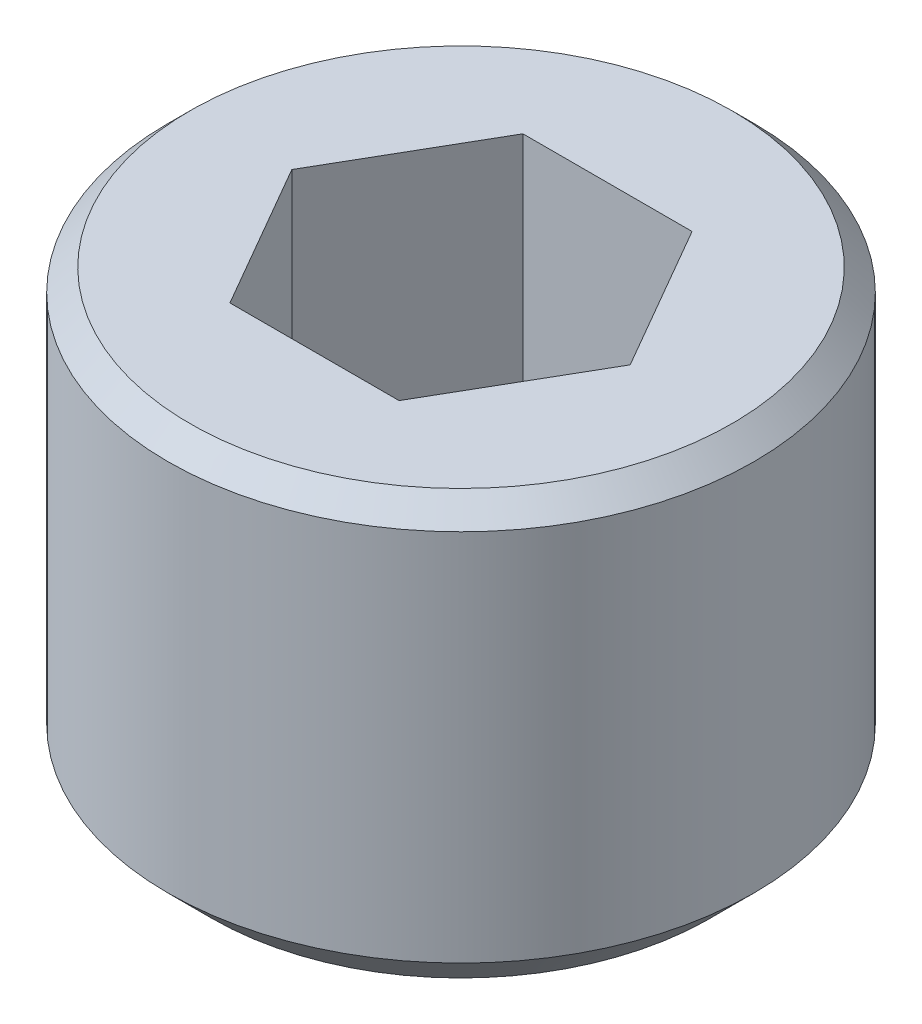
ISO-10303-21;
HEADER;
FILE_DESCRIPTION(('STEP AP214'),'2;1');
FILE_NAME('part.step','',(''),(''),'','','');
FILE_SCHEMA(('AUTOMOTIVE_DESIGN { 1 0 10303 214 1 1 1 1 }'));
ENDSEC;
DATA;
#1=APPLICATION_CONTEXT('core data for automotive mechanical design processes');
#2=APPLICATION_PROTOCOL_DEFINITION('international standard','automotive_design',2000,#1);
#3=PRODUCT_CONTEXT('',#1,'mechanical');
#4=PRODUCT('Part','Part','',(#3));
#5=PRODUCT_RELATED_PRODUCT_CATEGORY('part','',(#4));
#6=PRODUCT_DEFINITION_FORMATION('','',#4);
#7=PRODUCT_DEFINITION_CONTEXT('part definition',#1,'design');
#8=PRODUCT_DEFINITION('design','',#6,#7);
#9=PRODUCT_DEFINITION_SHAPE('','',#8);
#10=(LENGTH_UNIT() NAMED_UNIT(*) SI_UNIT(.MILLI.,.METRE.));
#11=(NAMED_UNIT(*) PLANE_ANGLE_UNIT() SI_UNIT($,.RADIAN.));
#12=(NAMED_UNIT(*) SI_UNIT($,.STERADIAN.) SOLID_ANGLE_UNIT());
#13=UNCERTAINTY_MEASURE_WITH_UNIT(LENGTH_MEASURE(1.E-05),#10,'distance_accuracy_value','');
#14=(GEOMETRIC_REPRESENTATION_CONTEXT(3) GLOBAL_UNCERTAINTY_ASSIGNED_CONTEXT((#13)) GLOBAL_UNIT_ASSIGNED_CONTEXT((#10,
#11,#12)) REPRESENTATION_CONTEXT('',''));
#15=CARTESIAN_POINT('',(0.,0.,0.));
#16=DIRECTION('',(0.,0.,1.));
#17=DIRECTION('',(1.,0.,0.));
#18=AXIS2_PLACEMENT_3D('',#15,#16,#17);
#19=CARTESIAN_POINT('',(0.,0.,0.));
#20=DIRECTION('',(0.,-1.,0.));
#21=DIRECTION('',(0.,0.,-1.));
#22=AXIS2_PLACEMENT_3D('',#19,#20,#21);
#23=PLANE('',#22);
#24=CARTESIAN_POINT('',(0.,0.,0.));
#25=DIRECTION('',(0.,-1.,0.));
#26=DIRECTION('',(0.,0.,-1.));
#27=AXIS2_PLACEMENT_3D('',#24,#25,#26);
#28=CIRCLE('',#27,1.85);
#29=CARTESIAN_POINT('',(0.,0.,-1.85));
#30=VERTEX_POINT('',#29);
#31=EDGE_CURVE('E43',#30,#30,#28,.F.);
#32=ORIENTED_EDGE('',*,*,#31,.T.);
#33=EDGE_LOOP('',(#32));
#34=FACE_BOUND('',#33,.T.);
#35=DIRECTION('',(-0.5,0.,0.866025403784439));
#36=VECTOR('',#35,1.);
#37=CARTESIAN_POINT('',(-0.577350269189626,0.,-1.));
#38=LINE('',#37,#36);
#39=CARTESIAN_POINT('',(-0.577350269189626,0.,-1.));
#40=VERTEX_POINT('',#39);
#41=CARTESIAN_POINT('',(-1.15470053837925,0.,0.));
#42=VERTEX_POINT('',#41);
#43=EDGE_CURVE('E124',#40,#42,#38,.T.);
#44=ORIENTED_EDGE('',*,*,#43,.F.);
#45=DIRECTION('',(-1.,0.,0.));
#46=VECTOR('',#45,1.);
#47=CARTESIAN_POINT('',(0.577350269189626,0.,-1.));
#48=LINE('',#47,#46);
#49=CARTESIAN_POINT('',(0.577350269189626,0.,-1.));
#50=VERTEX_POINT('',#49);
#51=EDGE_CURVE('E50',#50,#40,#48,.T.);
#52=ORIENTED_EDGE('',*,*,#51,.F.);
#53=DIRECTION('',(-0.5,0.,-0.866025403784438));
#54=VECTOR('',#53,1.);
#55=CARTESIAN_POINT('',(1.15470053837925,0.,0.));
#56=LINE('',#55,#54);
#57=CARTESIAN_POINT('',(1.15470053837925,0.,0.));
#58=VERTEX_POINT('',#57);
#59=EDGE_CURVE('E133',#58,#50,#56,.T.);
#60=ORIENTED_EDGE('',*,*,#59,.F.);
#61=DIRECTION('',(0.5,0.,-0.866025403784439));
#62=VECTOR('',#61,1.);
#63=CARTESIAN_POINT('',(0.577350269189626,0.,1.));
#64=LINE('',#63,#62);
#65=CARTESIAN_POINT('',(0.577350269189626,0.,1.));
#66=VERTEX_POINT('',#65);
#67=EDGE_CURVE('E131',#66,#58,#64,.T.);
#68=ORIENTED_EDGE('',*,*,#67,.F.);
#69=DIRECTION('',(1.,0.,0.));
#70=VECTOR('',#69,1.);
#71=CARTESIAN_POINT('',(-0.577350269189626,0.,1.));
#72=LINE('',#71,#70);
#73=CARTESIAN_POINT('',(-0.577350269189626,0.,1.));
#74=VERTEX_POINT('',#73);
#75=EDGE_CURVE('E98',#74,#66,#72,.T.);
#76=ORIENTED_EDGE('',*,*,#75,.F.);
#77=DIRECTION('',(0.5,0.,0.866025403784439));
#78=VECTOR('',#77,1.);
#79=CARTESIAN_POINT('',(-1.15470053837925,0.,0.));
#80=LINE('',#79,#78);
#81=EDGE_CURVE('E127',#42,#74,#80,.T.);
#82=ORIENTED_EDGE('',*,*,#81,.F.);
#83=EDGE_LOOP('',(#44,#52,#60,#68,#76,#82));
#84=FACE_BOUND('',#83,.T.);
#85=ADVANCED_FACE('F35',(#34,#84),#23,.F.);
#86=CARTESIAN_POINT('',(0.,0.,0.));
#87=DIRECTION('',(0.,1.,0.));
#88=DIRECTION('',(0.,0.,1.));
#89=AXIS2_PLACEMENT_3D('',#86,#87,#88);
#90=CYLINDRICAL_SURFACE('',#89,2.);
#91=CARTESIAN_POINT('',(0.,-0.15,0.));
#92=DIRECTION('',(0.,-1.,0.));
#93=DIRECTION('',(0.,0.,-1.));
#94=AXIS2_PLACEMENT_3D('',#91,#92,#93);
#95=CIRCLE('',#94,2.);
#96=CARTESIAN_POINT('',(0.,-0.15,-2.));
#97=VERTEX_POINT('',#96);
#98=EDGE_CURVE('E11',#97,#97,#95,.T.);
#99=ORIENTED_EDGE('',*,*,#98,.T.);
#100=EDGE_LOOP('',(#99));
#101=FACE_BOUND('',#100,.T.);
#102=CARTESIAN_POINT('',(0.,-2.7,0.));
#103=DIRECTION('',(0.,1.,0.));
#104=DIRECTION('',(0.,0.,1.));
#105=AXIS2_PLACEMENT_3D('',#102,#103,#104);
#106=CIRCLE('',#105,2.);
#107=CARTESIAN_POINT('',(0.,-2.7,2.));
#108=VERTEX_POINT('',#107);
#109=EDGE_CURVE('E137',#108,#108,#106,.T.);
#110=ORIENTED_EDGE('',*,*,#109,.T.);
#111=EDGE_LOOP('',(#110));
#112=FACE_BOUND('',#111,.T.);
#113=ADVANCED_FACE('F161',(#101,#112),#90,.T.);
#114=CARTESIAN_POINT('',(2.,-3.,0.));
#115=DIRECTION('',(0.,1.,0.));
#116=DIRECTION('',(0.,0.,1.));
#117=AXIS2_PLACEMENT_3D('',#114,#115,#116);
#118=PLANE('',#117);
#119=CARTESIAN_POINT('',(0.,-3.,0.));
#120=DIRECTION('',(0.,1.,0.));
#121=DIRECTION('',(0.,0.,1.));
#122=AXIS2_PLACEMENT_3D('',#119,#120,#121);
#123=CIRCLE('',#122,1.7);
#124=CARTESIAN_POINT('',(0.,-3.,1.7));
#125=VERTEX_POINT('',#124);
#126=EDGE_CURVE('E145',#125,#125,#123,.F.);
#127=ORIENTED_EDGE('',*,*,#126,.T.);
#128=EDGE_LOOP('',(#127));
#129=FACE_BOUND('',#128,.T.);
#130=ADVANCED_FACE('F166',(#129),#118,.F.);
#131=CARTESIAN_POINT('',(0.577350269189626,-2.,-1.));
#132=DIRECTION('',(0.,0.,-1.));
#133=DIRECTION('',(-1.,0.,0.));
#134=AXIS2_PLACEMENT_3D('',#131,#132,#133);
#135=PLANE('',#134);
#136=ORIENTED_EDGE('',*,*,#51,.T.);
#137=DIRECTION('',(0.,1.,0.));
#138=VECTOR('',#137,1.);
#139=CARTESIAN_POINT('',(-0.577350269189626,-2.,-1.));
#140=LINE('',#139,#138);
#141=CARTESIAN_POINT('',(-0.577350269189626,-2.,-1.));
#142=VERTEX_POINT('',#141);
#143=EDGE_CURVE('E80',#142,#40,#140,.T.);
#144=ORIENTED_EDGE('',*,*,#143,.F.);
#145=DIRECTION('',(-1.,0.,0.));
#146=VECTOR('',#145,1.);
#147=CARTESIAN_POINT('',(0.577350269189626,-2.,-1.));
#148=LINE('',#147,#146);
#149=CARTESIAN_POINT('',(0.577350269189626,-2.,-1.));
#150=VERTEX_POINT('',#149);
#151=EDGE_CURVE('E135',#150,#142,#148,.T.);
#152=ORIENTED_EDGE('',*,*,#151,.F.);
#153=DIRECTION('',(0.,1.,0.));
#154=VECTOR('',#153,1.);
#155=CARTESIAN_POINT('',(0.577350269189626,-2.,-1.));
#156=LINE('',#155,#154);
#157=EDGE_CURVE('E58',#150,#50,#156,.T.);
#158=ORIENTED_EDGE('',*,*,#157,.T.);
#159=EDGE_LOOP('',(#136,#144,#152,#158));
#160=FACE_BOUND('',#159,.T.);
#161=ADVANCED_FACE('F172',(#160),#135,.F.);
#162=CARTESIAN_POINT('',(1.15470053837925,-2.,0.));
#163=DIRECTION('',(0.866025403784439,0.,-0.5));
#164=DIRECTION('',(-0.5,0.,-0.866025403784439));
#165=AXIS2_PLACEMENT_3D('',#162,#163,#164);
#166=PLANE('',#165);
#167=ORIENTED_EDGE('',*,*,#59,.T.);
#168=ORIENTED_EDGE('',*,*,#157,.F.);
#169=DIRECTION('',(-0.5,0.,-0.866025403784438));
#170=VECTOR('',#169,1.);
#171=CARTESIAN_POINT('',(1.15470053837925,-2.,0.));
#172=LINE('',#171,#170);
#173=CARTESIAN_POINT('',(1.15470053837925,-2.,0.));
#174=VERTEX_POINT('',#173);
#175=EDGE_CURVE('E110',#174,#150,#172,.T.);
#176=ORIENTED_EDGE('',*,*,#175,.F.);
#177=DIRECTION('',(0.,1.,0.));
#178=VECTOR('',#177,1.);
#179=CARTESIAN_POINT('',(1.15470053837925,-2.,0.));
#180=LINE('',#179,#178);
#181=EDGE_CURVE('E102',#174,#58,#180,.T.);
#182=ORIENTED_EDGE('',*,*,#181,.T.);
#183=EDGE_LOOP('',(#167,#168,#176,#182));
#184=FACE_BOUND('',#183,.T.);
#185=ADVANCED_FACE('F176',(#184),#166,.F.);
#186=CARTESIAN_POINT('',(0.577350269189626,-2.,1.));
#187=DIRECTION('',(0.866025403784439,0.,0.5));
#188=DIRECTION('',(0.5,0.,-0.866025403784439));
#189=AXIS2_PLACEMENT_3D('',#186,#187,#188);
#190=PLANE('',#189);
#191=ORIENTED_EDGE('',*,*,#67,.T.);
#192=ORIENTED_EDGE('',*,*,#181,.F.);
#193=DIRECTION('',(0.5,0.,-0.866025403784439));
#194=VECTOR('',#193,1.);
#195=CARTESIAN_POINT('',(0.577350269189626,-2.,1.));
#196=LINE('',#195,#194);
#197=CARTESIAN_POINT('',(0.577350269189626,-2.,1.));
#198=VERTEX_POINT('',#197);
#199=EDGE_CURVE('E106',#198,#174,#196,.T.);
#200=ORIENTED_EDGE('',*,*,#199,.F.);
#201=DIRECTION('',(0.,1.,0.));
#202=VECTOR('',#201,1.);
#203=CARTESIAN_POINT('',(0.577350269189626,-2.,1.));
#204=LINE('',#203,#202);
#205=EDGE_CURVE('E91',#198,#66,#204,.T.);
#206=ORIENTED_EDGE('',*,*,#205,.T.);
#207=EDGE_LOOP('',(#191,#192,#200,#206));
#208=FACE_BOUND('',#207,.T.);
#209=ADVANCED_FACE('F107',(#208),#190,.F.);
#210=CARTESIAN_POINT('',(-0.577350269189626,-2.,1.));
#211=DIRECTION('',(0.,0.,1.));
#212=DIRECTION('',(1.,0.,0.));
#213=AXIS2_PLACEMENT_3D('',#210,#211,#212);
#214=PLANE('',#213);
#215=ORIENTED_EDGE('',*,*,#75,.T.);
#216=ORIENTED_EDGE('',*,*,#205,.F.);
#217=DIRECTION('',(1.,0.,0.));
#218=VECTOR('',#217,1.);
#219=CARTESIAN_POINT('',(-0.577350269189626,-2.,1.));
#220=LINE('',#219,#218);
#221=CARTESIAN_POINT('',(-0.577350269189626,-2.,1.));
#222=VERTEX_POINT('',#221);
#223=EDGE_CURVE('E95',#222,#198,#220,.T.);
#224=ORIENTED_EDGE('',*,*,#223,.F.);
#225=DIRECTION('',(0.,1.,0.));
#226=VECTOR('',#225,1.);
#227=CARTESIAN_POINT('',(-0.577350269189626,-2.,1.));
#228=LINE('',#227,#226);
#229=EDGE_CURVE('E103',#222,#74,#228,.T.);
#230=ORIENTED_EDGE('',*,*,#229,.T.);
#231=EDGE_LOOP('',(#215,#216,#224,#230));
#232=FACE_BOUND('',#231,.T.);
#233=ADVANCED_FACE('F93',(#232),#214,.F.);
#234=CARTESIAN_POINT('',(-1.15470053837925,-2.,0.));
#235=DIRECTION('',(-0.866025403784439,0.,0.5));
#236=DIRECTION('',(0.5,0.,0.866025403784439));
#237=AXIS2_PLACEMENT_3D('',#234,#235,#236);
#238=PLANE('',#237);
#239=ORIENTED_EDGE('',*,*,#81,.T.);
#240=ORIENTED_EDGE('',*,*,#229,.F.);
#241=DIRECTION('',(0.5,0.,0.866025403784439));
#242=VECTOR('',#241,1.);
#243=CARTESIAN_POINT('',(-1.15470053837925,-2.,0.));
#244=LINE('',#243,#242);
#245=CARTESIAN_POINT('',(-1.15470053837925,-2.,0.));
#246=VERTEX_POINT('',#245);
#247=EDGE_CURVE('E116',#246,#222,#244,.T.);
#248=ORIENTED_EDGE('',*,*,#247,.F.);
#249=DIRECTION('',(0.,1.,0.));
#250=VECTOR('',#249,1.);
#251=CARTESIAN_POINT('',(-1.15470053837925,-2.,0.));
#252=LINE('',#251,#250);
#253=EDGE_CURVE('E140',#246,#42,#252,.T.);
#254=ORIENTED_EDGE('',*,*,#253,.T.);
#255=EDGE_LOOP('',(#239,#240,#248,#254));
#256=FACE_BOUND('',#255,.T.);
#257=ADVANCED_FACE('F180',(#256),#238,.F.);
#258=CARTESIAN_POINT('',(-0.577350269189626,-2.,-1.));
#259=DIRECTION('',(-0.866025403784439,0.,-0.5));
#260=DIRECTION('',(-0.5,0.,0.866025403784439));
#261=AXIS2_PLACEMENT_3D('',#258,#259,#260);
#262=PLANE('',#261);
#263=ORIENTED_EDGE('',*,*,#43,.T.);
#264=ORIENTED_EDGE('',*,*,#253,.F.);
#265=DIRECTION('',(-0.5,0.,0.866025403784439));
#266=VECTOR('',#265,1.);
#267=CARTESIAN_POINT('',(-0.577350269189626,-2.,-1.));
#268=LINE('',#267,#266);
#269=EDGE_CURVE('E118',#142,#246,#268,.T.);
#270=ORIENTED_EDGE('',*,*,#269,.F.);
#271=ORIENTED_EDGE('',*,*,#143,.T.);
#272=EDGE_LOOP('',(#263,#264,#270,#271));
#273=FACE_BOUND('',#272,.T.);
#274=ADVANCED_FACE('F177',(#273),#262,.F.);
#275=CARTESIAN_POINT('',(-0.577350269189626,-2.,-1.));
#276=DIRECTION('',(0.,1.,0.));
#277=DIRECTION('',(0.,0.,1.));
#278=AXIS2_PLACEMENT_3D('',#275,#276,#277);
#279=PLANE('',#278);
#280=ORIENTED_EDGE('',*,*,#151,.T.);
#281=ORIENTED_EDGE('',*,*,#269,.T.);
#282=ORIENTED_EDGE('',*,*,#247,.T.);
#283=ORIENTED_EDGE('',*,*,#223,.T.);
#284=ORIENTED_EDGE('',*,*,#199,.T.);
#285=ORIENTED_EDGE('',*,*,#175,.T.);
#286=EDGE_LOOP('',(#280,#281,#282,#283,#284,#285));
#287=FACE_BOUND('',#286,.T.);
#288=ADVANCED_FACE('F113',(#287),#279,.T.);
#289=CARTESIAN_POINT('',(0.,-2.7,0.));
#290=DIRECTION('',(0.,1.,0.));
#291=DIRECTION('',(0.,0.,1.));
#292=AXIS2_PLACEMENT_3D('',#289,#290,#291);
#293=CONICAL_SURFACE('',#292,2.,0.785398163397449);
#294=ORIENTED_EDGE('',*,*,#126,.F.);
#295=EDGE_LOOP('',(#294));
#296=FACE_BOUND('',#295,.T.);
#297=ORIENTED_EDGE('',*,*,#109,.F.);
#298=EDGE_LOOP('',(#297));
#299=FACE_BOUND('',#298,.T.);
#300=ADVANCED_FACE('F153',(#296,#299),#293,.T.);
#301=CARTESIAN_POINT('',(0.,0.,0.));
#302=DIRECTION('',(0.,-1.,0.));
#303=DIRECTION('',(0.,0.,-1.));
#304=AXIS2_PLACEMENT_3D('',#301,#302,#303);
#305=CONICAL_SURFACE('',#304,1.85,0.785398163397448);
#306=ORIENTED_EDGE('',*,*,#98,.F.);
#307=EDGE_LOOP('',(#306));
#308=FACE_BOUND('',#307,.T.);
#309=ORIENTED_EDGE('',*,*,#31,.F.);
#310=EDGE_LOOP('',(#309));
#311=FACE_BOUND('',#310,.T.);
#312=ADVANCED_FACE('F37',(#308,#311),#305,.T.);
#313=CLOSED_SHELL('',(#85,#113,#130,#161,#185,#209,#233,#257,#274,#288,#300,#312));
#314=MANIFOLD_SOLID_BREP('B2',#313);
#315=ADVANCED_BREP_SHAPE_REPRESENTATION('',(#18,#314),#14);
#316=SHAPE_DEFINITION_REPRESENTATION(#9,#315);
ENDSEC;
END-ISO-10303-21;
